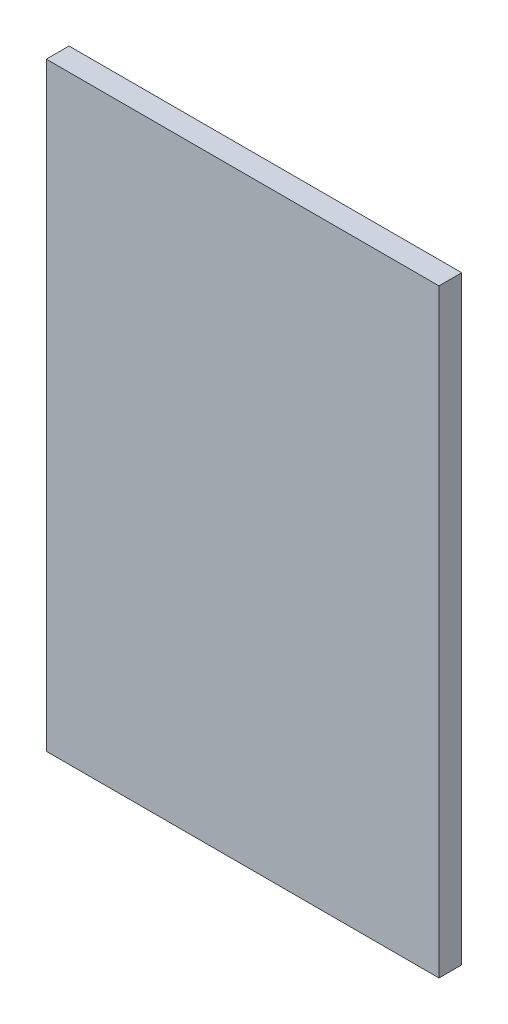
ISO-10303-21;
HEADER;
FILE_DESCRIPTION(('STEP AP214'),'2;1');
FILE_NAME('part.step','',(''),(''),'','','');
FILE_SCHEMA(('AUTOMOTIVE_DESIGN { 1 0 10303 214 1 1 1 1 }'));
ENDSEC;
DATA;
#1=APPLICATION_CONTEXT('core data for automotive mechanical design processes');
#2=APPLICATION_PROTOCOL_DEFINITION('international standard','automotive_design',2000,#1);
#3=PRODUCT_CONTEXT('',#1,'mechanical');
#4=PRODUCT('Part','Part','',(#3));
#5=PRODUCT_RELATED_PRODUCT_CATEGORY('part','',(#4));
#6=PRODUCT_DEFINITION_FORMATION('','',#4);
#7=PRODUCT_DEFINITION_CONTEXT('part definition',#1,'design');
#8=PRODUCT_DEFINITION('design','',#6,#7);
#9=PRODUCT_DEFINITION_SHAPE('','',#8);
#10=(LENGTH_UNIT() NAMED_UNIT(*) SI_UNIT(.MILLI.,.METRE.));
#11=(NAMED_UNIT(*) PLANE_ANGLE_UNIT() SI_UNIT($,.RADIAN.));
#12=(NAMED_UNIT(*) SI_UNIT($,.STERADIAN.) SOLID_ANGLE_UNIT());
#13=UNCERTAINTY_MEASURE_WITH_UNIT(LENGTH_MEASURE(1.E-05),#10,'distance_accuracy_value','');
#14=(GEOMETRIC_REPRESENTATION_CONTEXT(3) GLOBAL_UNCERTAINTY_ASSIGNED_CONTEXT((#13)) GLOBAL_UNIT_ASSIGNED_CONTEXT((#10,
#11,#12)) REPRESENTATION_CONTEXT('',''));
#15=CARTESIAN_POINT('',(0.,0.,0.));
#16=DIRECTION('',(0.,0.,1.));
#17=DIRECTION('',(1.,0.,0.));
#18=AXIS2_PLACEMENT_3D('',#15,#16,#17);
#19=CARTESIAN_POINT('',(7.700005975206,9.575007104279,0.55));
#20=DIRECTION('',(0.,0.,1.));
#21=DIRECTION('',(1.,0.,0.));
#22=AXIS2_PLACEMENT_3D('',#19,#20,#21);
#23=PLANE('',#22);
#24=DIRECTION('',(-0.999999999999999,-4.371138828674E-08,0.));
#25=VECTOR('',#24,1.);
#26=CARTESIAN_POINT('',(7.700005911825,11.025007104279,0.55));
#27=LINE('',#26,#25);
#28=CARTESIAN_POINT('',(6.75000591182487,11.025007083516,0.55));
#29=VERTEX_POINT('',#28);
#30=CARTESIAN_POINT('',(7.70000592766999,11.025007104279,0.55));
#31=VERTEX_POINT('',#30);
#32=EDGE_CURVE('E76',#29,#31,#27,.F.);
#33=ORIENTED_EDGE('',*,*,#32,.F.);
#34=DIRECTION('',(4.371138828674E-08,-0.999999999999999,0.));
#35=VECTOR('',#34,1.);
#36=CARTESIAN_POINT('',(6.750005975206,9.575007062753,0.55));
#37=LINE('',#36,#35);
#38=CARTESIAN_POINT('',(6.75000595936075,9.57500706275309,0.55));
#39=VERTEX_POINT('',#38);
#40=EDGE_CURVE('E58',#39,#29,#37,.F.);
#41=ORIENTED_EDGE('',*,*,#40,.F.);
#42=DIRECTION('',(-0.999999999999999,-4.371138828674E-08,0.));
#43=VECTOR('',#42,1.);
#44=CARTESIAN_POINT('',(7.700005975206,9.575007104279,0.55));
#45=LINE('',#44,#43);
#46=CARTESIAN_POINT('',(7.700005975206,9.5750070938975,0.55));
#47=VERTEX_POINT('',#46);
#48=EDGE_CURVE('E20',#39,#47,#45,.F.);
#49=ORIENTED_EDGE('',*,*,#48,.T.);
#50=DIRECTION('',(4.371138828674E-08,-0.999999999999999,0.));
#51=VECTOR('',#50,1.);
#52=CARTESIAN_POINT('',(7.700005975206,9.575007104279,0.55));
#53=LINE('',#52,#51);
#54=EDGE_CURVE('E55',#47,#31,#53,.F.);
#55=ORIENTED_EDGE('',*,*,#54,.T.);
#56=EDGE_LOOP('',(#33,#41,#49,#55));
#57=FACE_BOUND('',#56,.T.);
#58=ADVANCED_FACE('F17',(#57),#23,.T.);
#59=CARTESIAN_POINT('',(7.700005975206,9.575007104279,0.495));
#60=DIRECTION('',(-4.371138828674E-08,0.999999999999999,0.));
#61=DIRECTION('',(-0.999999999999999,-4.371138828674E-08,0.));
#62=AXIS2_PLACEMENT_3D('',#59,#60,#61);
#63=PLANE('',#62);
#64=DIRECTION('',(0.,0.,1.));
#65=VECTOR('',#64,1.);
#66=CARTESIAN_POINT('',(6.750005975206,9.575007062753,0.495));
#67=LINE('',#66,#65);
#68=CARTESIAN_POINT('',(6.75000595936075,9.57500706275309,0.495));
#69=VERTEX_POINT('',#68);
#70=EDGE_CURVE('E78',#69,#39,#67,.T.);
#71=ORIENTED_EDGE('',*,*,#70,.F.);
#72=DIRECTION('',(1.,0.,0.));
#73=VECTOR('',#72,1.);
#74=CARTESIAN_POINT('',(7.700005975206,9.575007062753,0.495));
#75=LINE('',#74,#73);
#76=CARTESIAN_POINT('',(7.700005975206,9.5750070938975,0.495));
#77=VERTEX_POINT('',#76);
#78=EDGE_CURVE('E73',#69,#77,#75,.T.);
#79=ORIENTED_EDGE('',*,*,#78,.T.);
#80=DIRECTION('',(0.,0.,1.));
#81=VECTOR('',#80,1.);
#82=CARTESIAN_POINT('',(7.700005975206,9.575007104279,0.495));
#83=LINE('',#82,#81);
#84=EDGE_CURVE('E63',#77,#47,#83,.T.);
#85=ORIENTED_EDGE('',*,*,#84,.T.);
#86=ORIENTED_EDGE('',*,*,#48,.F.);
#87=EDGE_LOOP('',(#71,#79,#85,#86));
#88=FACE_BOUND('',#87,.T.);
#89=ADVANCED_FACE('F72',(#88),#63,.F.);
#90=CARTESIAN_POINT('',(7.700005975206,9.575007104279,0.495));
#91=DIRECTION('',(-0.999999999999999,-4.371138828674E-08,0.));
#92=DIRECTION('',(4.371138828674E-08,-0.999999999999999,0.));
#93=AXIS2_PLACEMENT_3D('',#90,#91,#92);
#94=PLANE('',#93);
#95=ORIENTED_EDGE('',*,*,#54,.F.);
#96=ORIENTED_EDGE('',*,*,#84,.F.);
#97=DIRECTION('',(0.,1.,0.));
#98=VECTOR('',#97,1.);
#99=CARTESIAN_POINT('',(7.700005975206,9.575007104279,0.495));
#100=LINE('',#99,#98);
#101=CARTESIAN_POINT('',(7.70000592766999,11.025007104279,0.495));
#102=VERTEX_POINT('',#101);
#103=EDGE_CURVE('E83',#77,#102,#100,.T.);
#104=ORIENTED_EDGE('',*,*,#103,.T.);
#105=DIRECTION('',(0.,0.,1.));
#106=VECTOR('',#105,1.);
#107=CARTESIAN_POINT('',(7.700005911825,11.025007104279,0.495));
#108=LINE('',#107,#106);
#109=EDGE_CURVE('E69',#31,#102,#108,.F.);
#110=ORIENTED_EDGE('',*,*,#109,.F.);
#111=EDGE_LOOP('',(#95,#96,#104,#110));
#112=FACE_BOUND('',#111,.T.);
#113=ADVANCED_FACE('F66',(#112),#94,.F.);
#114=CARTESIAN_POINT('',(7.700005911825,11.025007104279,0.495));
#115=DIRECTION('',(-4.371138828674E-08,0.999999999999999,0.));
#116=DIRECTION('',(-0.999999999999999,-4.371138828674E-08,0.));
#117=AXIS2_PLACEMENT_3D('',#114,#115,#116);
#118=PLANE('',#117);
#119=DIRECTION('',(0.,0.,1.));
#120=VECTOR('',#119,1.);
#121=CARTESIAN_POINT('',(6.75000591182449,11.025007062753,0.495));
#122=LINE('',#121,#120);
#123=CARTESIAN_POINT('',(6.75000591182487,11.0250070731346,0.495));
#124=VERTEX_POINT('',#123);
#125=EDGE_CURVE('E34',#29,#124,#122,.F.);
#126=ORIENTED_EDGE('',*,*,#125,.F.);
#127=ORIENTED_EDGE('',*,*,#32,.T.);
#128=ORIENTED_EDGE('',*,*,#109,.T.);
#129=DIRECTION('',(1.,0.,0.));
#130=VECTOR('',#129,1.);
#131=CARTESIAN_POINT('',(7.700005975206,11.025007104279,0.495));
#132=LINE('',#131,#130);
#133=EDGE_CURVE('E26',#102,#124,#132,.F.);
#134=ORIENTED_EDGE('',*,*,#133,.T.);
#135=EDGE_LOOP('',(#126,#127,#128,#134));
#136=FACE_BOUND('',#135,.T.);
#137=ADVANCED_FACE('F88',(#136),#118,.T.);
#138=CARTESIAN_POINT('',(6.750005975206,9.575007062753,0.495));
#139=DIRECTION('',(-0.999999999999999,-4.371138828674E-08,0.));
#140=DIRECTION('',(4.371138828674E-08,-0.999999999999999,0.));
#141=AXIS2_PLACEMENT_3D('',#138,#139,#140);
#142=PLANE('',#141);
#143=ORIENTED_EDGE('',*,*,#40,.T.);
#144=ORIENTED_EDGE('',*,*,#125,.T.);
#145=DIRECTION('',(0.,1.,0.));
#146=VECTOR('',#145,1.);
#147=CARTESIAN_POINT('',(6.750005911825,9.575007104279,0.495));
#148=LINE('',#147,#146);
#149=EDGE_CURVE('E11',#124,#69,#148,.F.);
#150=ORIENTED_EDGE('',*,*,#149,.T.);
#151=ORIENTED_EDGE('',*,*,#70,.T.);
#152=EDGE_LOOP('',(#143,#144,#150,#151));
#153=FACE_BOUND('',#152,.T.);
#154=ADVANCED_FACE('F91',(#153),#142,.T.);
#155=CARTESIAN_POINT('',(7.700005975206,9.575007104279,0.495));
#156=DIRECTION('',(0.,0.,1.));
#157=DIRECTION('',(1.,0.,0.));
#158=AXIS2_PLACEMENT_3D('',#155,#156,#157);
#159=PLANE('',#158);
#160=ORIENTED_EDGE('',*,*,#133,.F.);
#161=ORIENTED_EDGE('',*,*,#103,.F.);
#162=ORIENTED_EDGE('',*,*,#78,.F.);
#163=ORIENTED_EDGE('',*,*,#149,.F.);
#164=EDGE_LOOP('',(#160,#161,#162,#163));
#165=FACE_BOUND('',#164,.T.);
#166=ADVANCED_FACE('F90',(#165),#159,.F.);
#167=CLOSED_SHELL('',(#58,#89,#113,#137,#154,#166));
#168=MANIFOLD_SOLID_BREP('B1',#167);
#169=ADVANCED_BREP_SHAPE_REPRESENTATION('',(#18,#168),#14);
#170=SHAPE_DEFINITION_REPRESENTATION(#9,#169);
ENDSEC;
END-ISO-10303-21;
